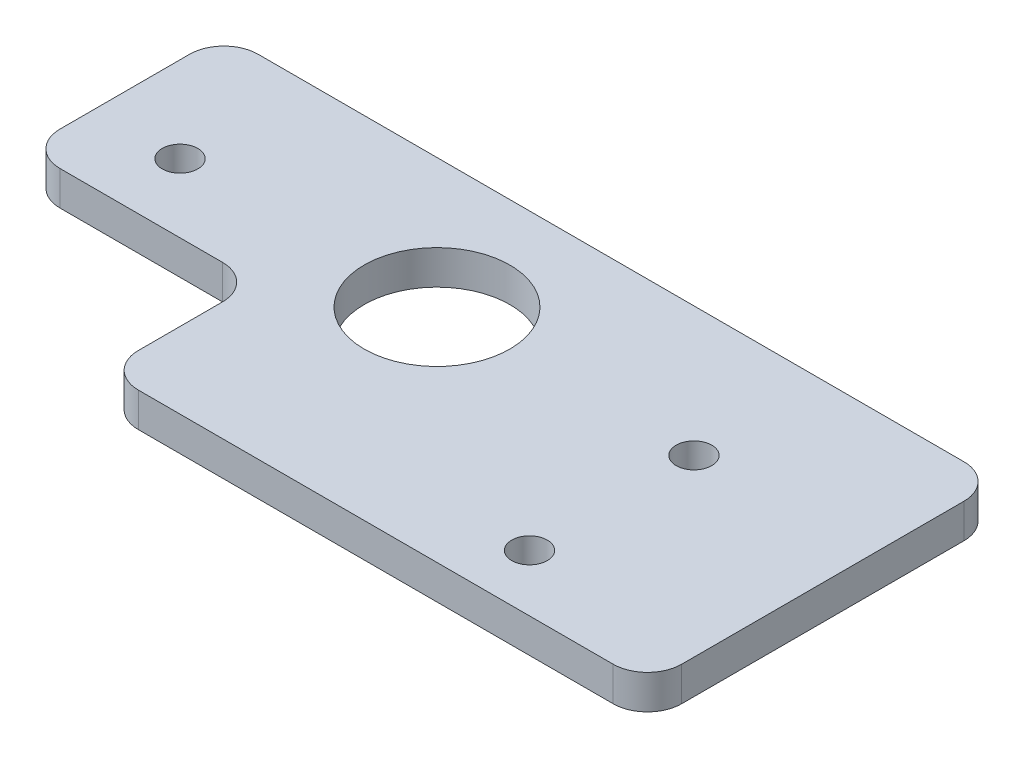
ISO-10303-21;
HEADER;
FILE_DESCRIPTION(('STEP AP214'),'2;1');
FILE_NAME('part.step','',(''),(''),'','','');
FILE_SCHEMA(('AUTOMOTIVE_DESIGN { 1 0 10303 214 1 1 1 1 }'));
ENDSEC;
DATA;
#1=APPLICATION_CONTEXT('core data for automotive mechanical design processes');
#2=APPLICATION_PROTOCOL_DEFINITION('international standard','automotive_design',2000,#1);
#3=PRODUCT_CONTEXT('',#1,'mechanical');
#4=PRODUCT('Part','Part','',(#3));
#5=PRODUCT_RELATED_PRODUCT_CATEGORY('part','',(#4));
#6=PRODUCT_DEFINITION_FORMATION('','',#4);
#7=PRODUCT_DEFINITION_CONTEXT('part definition',#1,'design');
#8=PRODUCT_DEFINITION('design','',#6,#7);
#9=PRODUCT_DEFINITION_SHAPE('','',#8);
#10=(LENGTH_UNIT() NAMED_UNIT(*) SI_UNIT(.MILLI.,.METRE.));
#11=(NAMED_UNIT(*) PLANE_ANGLE_UNIT() SI_UNIT($,.RADIAN.));
#12=(NAMED_UNIT(*) SI_UNIT($,.STERADIAN.) SOLID_ANGLE_UNIT());
#13=UNCERTAINTY_MEASURE_WITH_UNIT(LENGTH_MEASURE(1.E-05),#10,'distance_accuracy_value','');
#14=(GEOMETRIC_REPRESENTATION_CONTEXT(3) GLOBAL_UNCERTAINTY_ASSIGNED_CONTEXT((#13)) GLOBAL_UNIT_ASSIGNED_CONTEXT((#10,
#11,#12)) REPRESENTATION_CONTEXT('',''));
#15=CARTESIAN_POINT('',(0.,0.,0.));
#16=DIRECTION('',(0.,0.,1.));
#17=DIRECTION('',(1.,0.,0.));
#18=AXIS2_PLACEMENT_3D('',#15,#16,#17);
#19=CARTESIAN_POINT('',(0.,3.175,0.));
#20=DIRECTION('',(1.,0.,0.));
#21=DIRECTION('',(0.,0.,-1.));
#22=AXIS2_PLACEMENT_3D('',#19,#20,#21);
#23=PLANE('',#22);
#24=DIRECTION('',(0.,0.,1.));
#25=VECTOR('',#24,1.);
#26=CARTESIAN_POINT('',(0.,0.,0.));
#27=LINE('',#26,#25);
#28=CARTESIAN_POINT('',(0.,0.,-29.325));
#29=VERTEX_POINT('',#28);
#30=CARTESIAN_POINT('',(0.,0.,-17.325));
#31=VERTEX_POINT('',#30);
#32=EDGE_CURVE('E147',#29,#31,#27,.T.);
#33=ORIENTED_EDGE('',*,*,#32,.T.);
#34=DIRECTION('',(0.,1.,0.));
#35=VECTOR('',#34,1.);
#36=CARTESIAN_POINT('',(0.,3.175,-17.325));
#37=LINE('',#36,#35);
#38=CARTESIAN_POINT('',(0.,3.175,-17.325));
#39=VERTEX_POINT('',#38);
#40=EDGE_CURVE('E151',#31,#39,#37,.T.);
#41=ORIENTED_EDGE('',*,*,#40,.T.);
#42=DIRECTION('',(0.,0.,1.));
#43=VECTOR('',#42,1.);
#44=CARTESIAN_POINT('',(0.,3.175,0.));
#45=LINE('',#44,#43);
#46=CARTESIAN_POINT('',(0.,3.175,-29.325));
#47=VERTEX_POINT('',#46);
#48=EDGE_CURVE('E150',#47,#39,#45,.T.);
#49=ORIENTED_EDGE('',*,*,#48,.F.);
#50=DIRECTION('',(0.,-1.,0.));
#51=VECTOR('',#50,1.);
#52=CARTESIAN_POINT('',(0.,3.175,-29.325));
#53=LINE('',#52,#51);
#54=EDGE_CURVE('E135',#47,#29,#53,.T.);
#55=ORIENTED_EDGE('',*,*,#54,.T.);
#56=EDGE_LOOP('',(#33,#41,#49,#55));
#57=FACE_BOUND('',#56,.T.);
#58=ADVANCED_FACE('F41',(#57),#23,.F.);
#59=CARTESIAN_POINT('',(0.,3.175,0.));
#60=DIRECTION('',(0.,0.,-1.));
#61=DIRECTION('',(-1.,0.,0.));
#62=AXIS2_PLACEMENT_3D('',#59,#60,#61);
#63=PLANE('',#62);
#64=DIRECTION('',(1.,0.,0.));
#65=VECTOR('',#64,1.);
#66=CARTESIAN_POINT('',(0.,0.,0.));
#67=LINE('',#66,#65);
#68=CARTESIAN_POINT('',(24.575,0.,0.));
#69=VERTEX_POINT('',#68);
#70=CARTESIAN_POINT('',(68.575,0.,0.));
#71=VERTEX_POINT('',#70);
#72=EDGE_CURVE('E158',#69,#71,#67,.T.);
#73=ORIENTED_EDGE('',*,*,#72,.T.);
#74=DIRECTION('',(0.,-1.,0.));
#75=VECTOR('',#74,1.);
#76=CARTESIAN_POINT('',(68.575,3.175,0.));
#77=LINE('',#76,#75);
#78=CARTESIAN_POINT('',(68.575,3.175,0.));
#79=VERTEX_POINT('',#78);
#80=EDGE_CURVE('E210',#71,#79,#77,.F.);
#81=ORIENTED_EDGE('',*,*,#80,.T.);
#82=DIRECTION('',(1.,0.,0.));
#83=VECTOR('',#82,1.);
#84=CARTESIAN_POINT('',(0.,3.175,0.));
#85=LINE('',#84,#83);
#86=CARTESIAN_POINT('',(24.575,3.175,0.));
#87=VERTEX_POINT('',#86);
#88=EDGE_CURVE('E256',#87,#79,#85,.T.);
#89=ORIENTED_EDGE('',*,*,#88,.F.);
#90=DIRECTION('',(0.,1.,0.));
#91=VECTOR('',#90,1.);
#92=CARTESIAN_POINT('',(24.575,3.175,0.));
#93=LINE('',#92,#91);
#94=EDGE_CURVE('E208',#87,#69,#93,.F.);
#95=ORIENTED_EDGE('',*,*,#94,.T.);
#96=EDGE_LOOP('',(#73,#81,#89,#95));
#97=FACE_BOUND('',#96,.T.);
#98=ADVANCED_FACE('F279',(#97),#63,.F.);
#99=CARTESIAN_POINT('',(71.75,3.175,0.));
#100=DIRECTION('',(-1.,0.,0.));
#101=DIRECTION('',(0.,0.,1.));
#102=AXIS2_PLACEMENT_3D('',#99,#100,#101);
#103=PLANE('',#102);
#104=DIRECTION('',(0.,0.,-1.));
#105=VECTOR('',#104,1.);
#106=CARTESIAN_POINT('',(71.75,0.,0.));
#107=LINE('',#106,#105);
#108=CARTESIAN_POINT('',(71.75,0.,-3.175));
#109=VERTEX_POINT('',#108);
#110=CARTESIAN_POINT('',(71.75,0.,-29.325));
#111=VERTEX_POINT('',#110);
#112=EDGE_CURVE('E162',#109,#111,#107,.T.);
#113=ORIENTED_EDGE('',*,*,#112,.T.);
#114=DIRECTION('',(0.,-1.,0.));
#115=VECTOR('',#114,1.);
#116=CARTESIAN_POINT('',(71.75,3.175,-29.325));
#117=LINE('',#116,#115);
#118=CARTESIAN_POINT('',(71.75,3.175,-29.325));
#119=VERTEX_POINT('',#118);
#120=EDGE_CURVE('E206',#111,#119,#117,.F.);
#121=ORIENTED_EDGE('',*,*,#120,.T.);
#122=DIRECTION('',(0.,0.,-1.));
#123=VECTOR('',#122,1.);
#124=CARTESIAN_POINT('',(71.75,3.175,0.));
#125=LINE('',#124,#123);
#126=CARTESIAN_POINT('',(71.75,3.175,-3.175));
#127=VERTEX_POINT('',#126);
#128=EDGE_CURVE('E258',#127,#119,#125,.T.);
#129=ORIENTED_EDGE('',*,*,#128,.F.);
#130=DIRECTION('',(0.,-1.,0.));
#131=VECTOR('',#130,1.);
#132=CARTESIAN_POINT('',(71.75,3.175,-3.175));
#133=LINE('',#132,#131);
#134=EDGE_CURVE('E203',#127,#109,#133,.T.);
#135=ORIENTED_EDGE('',*,*,#134,.T.);
#136=EDGE_LOOP('',(#113,#121,#129,#135));
#137=FACE_BOUND('',#136,.T.);
#138=ADVANCED_FACE('F272',(#137),#103,.F.);
#139=CARTESIAN_POINT('',(0.,3.175,-32.5));
#140=DIRECTION('',(0.,0.,1.));
#141=DIRECTION('',(1.,0.,0.));
#142=AXIS2_PLACEMENT_3D('',#139,#140,#141);
#143=PLANE('',#142);
#144=DIRECTION('',(-1.,0.,0.));
#145=VECTOR('',#144,1.);
#146=CARTESIAN_POINT('',(0.,0.,-32.5));
#147=LINE('',#146,#145);
#148=CARTESIAN_POINT('',(68.575,0.,-32.5));
#149=VERTEX_POINT('',#148);
#150=CARTESIAN_POINT('',(3.175,0.,-32.5));
#151=VERTEX_POINT('',#150);
#152=EDGE_CURVE('E172',#149,#151,#147,.T.);
#153=ORIENTED_EDGE('',*,*,#152,.T.);
#154=DIRECTION('',(0.,-1.,0.));
#155=VECTOR('',#154,1.);
#156=CARTESIAN_POINT('',(3.175,3.175,-32.5));
#157=LINE('',#156,#155);
#158=CARTESIAN_POINT('',(3.175,3.175,-32.5));
#159=VERTEX_POINT('',#158);
#160=EDGE_CURVE('E136',#151,#159,#157,.F.);
#161=ORIENTED_EDGE('',*,*,#160,.T.);
#162=DIRECTION('',(-1.,0.,0.));
#163=VECTOR('',#162,1.);
#164=CARTESIAN_POINT('',(0.,3.175,-32.5));
#165=LINE('',#164,#163);
#166=CARTESIAN_POINT('',(68.575,3.175,-32.5));
#167=VERTEX_POINT('',#166);
#168=EDGE_CURVE('E152',#167,#159,#165,.T.);
#169=ORIENTED_EDGE('',*,*,#168,.F.);
#170=DIRECTION('',(0.,-1.,0.));
#171=VECTOR('',#170,1.);
#172=CARTESIAN_POINT('',(68.575,3.175,-32.5));
#173=LINE('',#172,#171);
#174=EDGE_CURVE('E199',#167,#149,#173,.T.);
#175=ORIENTED_EDGE('',*,*,#174,.T.);
#176=EDGE_LOOP('',(#153,#161,#169,#175));
#177=FACE_BOUND('',#176,.T.);
#178=ADVANCED_FACE('F266',(#177),#143,.F.);
#179=CARTESIAN_POINT('',(0.,3.175,0.));
#180=DIRECTION('',(0.,-1.,0.));
#181=DIRECTION('',(0.,0.,-1.));
#182=AXIS2_PLACEMENT_3D('',#179,#180,#181);
#183=PLANE('',#182);
#184=CARTESIAN_POINT('',(31.75,3.175,-20.5));
#185=DIRECTION('',(0.,1.,0.));
#186=DIRECTION('',(0.,0.,1.));
#187=AXIS2_PLACEMENT_3D('',#184,#185,#186);
#188=CIRCLE('',#187,6.75);
#189=CARTESIAN_POINT('',(31.75,3.175,-13.75));
#190=VERTEX_POINT('',#189);
#191=EDGE_CURVE('E231',#190,#190,#188,.T.);
#192=ORIENTED_EDGE('',*,*,#191,.F.);
#193=EDGE_LOOP('',(#192));
#194=FACE_BOUND('',#193,.T.);
#195=CARTESIAN_POINT('',(7.9375,3.175,-20.5));
#196=DIRECTION('',(0.,1.,0.));
#197=DIRECTION('',(0.,0.,1.));
#198=AXIS2_PLACEMENT_3D('',#195,#196,#197);
#199=CIRCLE('',#198,1.64999999999999);
#200=CARTESIAN_POINT('',(7.9375,3.175,-18.85));
#201=VERTEX_POINT('',#200);
#202=EDGE_CURVE('E240',#201,#201,#199,.T.);
#203=ORIENTED_EDGE('',*,*,#202,.F.);
#204=EDGE_LOOP('',(#203));
#205=FACE_BOUND('',#204,.T.);
#206=CARTESIAN_POINT('',(55.5625,3.175,-20.5));
#207=DIRECTION('',(0.,1.,0.));
#208=DIRECTION('',(0.,0.,1.));
#209=AXIS2_PLACEMENT_3D('',#206,#207,#208);
#210=CIRCLE('',#209,1.64999999999998);
#211=CARTESIAN_POINT('',(55.5625,3.175,-18.85));
#212=VERTEX_POINT('',#211);
#213=EDGE_CURVE('E247',#212,#212,#210,.T.);
#214=ORIENTED_EDGE('',*,*,#213,.F.);
#215=EDGE_LOOP('',(#214));
#216=FACE_BOUND('',#215,.T.);
#217=CARTESIAN_POINT('',(55.5625,3.175,-5.26));
#218=DIRECTION('',(0.,1.,0.));
#219=DIRECTION('',(0.,0.,1.));
#220=AXIS2_PLACEMENT_3D('',#217,#218,#219);
#221=CIRCLE('',#220,1.64999999999998);
#222=CARTESIAN_POINT('',(55.5625,3.175,-3.61000000000002));
#223=VERTEX_POINT('',#222);
#224=EDGE_CURVE('E165',#223,#223,#221,.T.);
#225=ORIENTED_EDGE('',*,*,#224,.F.);
#226=EDGE_LOOP('',(#225));
#227=FACE_BOUND('',#226,.T.);
#228=ORIENTED_EDGE('',*,*,#48,.T.);
#229=CARTESIAN_POINT('',(3.175,3.175,-17.325));
#230=DIRECTION('',(0.,-1.,0.));
#231=DIRECTION('',(0.,0.,-1.));
#232=AXIS2_PLACEMENT_3D('',#229,#230,#231);
#233=CIRCLE('',#232,3.175);
#234=CARTESIAN_POINT('',(3.175,3.175,-14.15));
#235=VERTEX_POINT('',#234);
#236=EDGE_CURVE('E183',#39,#235,#233,.F.);
#237=ORIENTED_EDGE('',*,*,#236,.T.);
#238=DIRECTION('',(-1.,0.,0.));
#239=VECTOR('',#238,1.);
#240=CARTESIAN_POINT('',(0.,3.175,-14.15));
#241=LINE('',#240,#239);
#242=CARTESIAN_POINT('',(18.225,3.175,-14.15));
#243=VERTEX_POINT('',#242);
#244=EDGE_CURVE('E217',#243,#235,#241,.T.);
#245=ORIENTED_EDGE('',*,*,#244,.F.);
#246=CARTESIAN_POINT('',(18.225,3.175,-10.975));
#247=DIRECTION('',(0.,-1.,0.));
#248=DIRECTION('',(0.,0.,-1.));
#249=AXIS2_PLACEMENT_3D('',#246,#247,#248);
#250=CIRCLE('',#249,3.175);
#251=CARTESIAN_POINT('',(21.4,3.175,-10.975));
#252=VERTEX_POINT('',#251);
#253=EDGE_CURVE('E49',#243,#252,#250,.T.);
#254=ORIENTED_EDGE('',*,*,#253,.T.);
#255=DIRECTION('',(0.,0.,-1.));
#256=VECTOR('',#255,1.);
#257=CARTESIAN_POINT('',(21.4,3.175,0.));
#258=LINE('',#257,#256);
#259=CARTESIAN_POINT('',(21.4,3.175,-3.175));
#260=VERTEX_POINT('',#259);
#261=EDGE_CURVE('E215',#260,#252,#258,.T.);
#262=ORIENTED_EDGE('',*,*,#261,.F.);
#263=CARTESIAN_POINT('',(24.575,3.175,-3.175));
#264=DIRECTION('',(0.,-1.,0.));
#265=DIRECTION('',(0.,0.,-1.));
#266=AXIS2_PLACEMENT_3D('',#263,#264,#265);
#267=CIRCLE('',#266,3.175);
#268=EDGE_CURVE('E175',#260,#87,#267,.F.);
#269=ORIENTED_EDGE('',*,*,#268,.T.);
#270=ORIENTED_EDGE('',*,*,#88,.T.);
#271=CARTESIAN_POINT('',(68.575,3.175,-3.175));
#272=DIRECTION('',(0.,-1.,0.));
#273=DIRECTION('',(0.,0.,-1.));
#274=AXIS2_PLACEMENT_3D('',#271,#272,#273);
#275=CIRCLE('',#274,3.175);
#276=EDGE_CURVE('E177',#79,#127,#275,.F.);
#277=ORIENTED_EDGE('',*,*,#276,.T.);
#278=ORIENTED_EDGE('',*,*,#128,.T.);
#279=CARTESIAN_POINT('',(68.575,3.175,-29.325));
#280=DIRECTION('',(0.,-1.,0.));
#281=DIRECTION('',(0.,0.,-1.));
#282=AXIS2_PLACEMENT_3D('',#279,#280,#281);
#283=CIRCLE('',#282,3.175);
#284=EDGE_CURVE('E179',#119,#167,#283,.F.);
#285=ORIENTED_EDGE('',*,*,#284,.T.);
#286=ORIENTED_EDGE('',*,*,#168,.T.);
#287=CARTESIAN_POINT('',(3.175,3.175,-29.325));
#288=DIRECTION('',(0.,-1.,0.));
#289=DIRECTION('',(0.,0.,-1.));
#290=AXIS2_PLACEMENT_3D('',#287,#288,#289);
#291=CIRCLE('',#290,3.175);
#292=EDGE_CURVE('E181',#159,#47,#291,.F.);
#293=ORIENTED_EDGE('',*,*,#292,.T.);
#294=EDGE_LOOP('',(#228,#237,#245,#254,#262,#269,#270,#277,#278,#285,#286,#293));
#295=FACE_BOUND('',#294,.T.);
#296=ADVANCED_FACE('F214',(#194,#205,#216,#227,#295),#183,.F.);
#297=CARTESIAN_POINT('',(0.,0.,0.));
#298=DIRECTION('',(0.,-1.,0.));
#299=DIRECTION('',(0.,0.,-1.));
#300=AXIS2_PLACEMENT_3D('',#297,#298,#299);
#301=PLANE('',#300);
#302=DIRECTION('',(-1.,0.,0.));
#303=VECTOR('',#302,1.);
#304=CARTESIAN_POINT('',(0.,0.,-14.15));
#305=LINE('',#304,#303);
#306=CARTESIAN_POINT('',(18.225,0.,-14.15));
#307=VERTEX_POINT('',#306);
#308=CARTESIAN_POINT('',(3.175,0.,-14.15));
#309=VERTEX_POINT('',#308);
#310=EDGE_CURVE('E226',#307,#309,#305,.T.);
#311=ORIENTED_EDGE('',*,*,#310,.T.);
#312=CARTESIAN_POINT('',(3.175,0.,-17.325));
#313=DIRECTION('',(0.,-1.,0.));
#314=DIRECTION('',(0.,0.,-1.));
#315=AXIS2_PLACEMENT_3D('',#312,#313,#314);
#316=CIRCLE('',#315,3.175);
#317=EDGE_CURVE('E140',#309,#31,#316,.T.);
#318=ORIENTED_EDGE('',*,*,#317,.T.);
#319=ORIENTED_EDGE('',*,*,#32,.F.);
#320=CARTESIAN_POINT('',(3.175,0.,-29.325));
#321=DIRECTION('',(0.,-1.,0.));
#322=DIRECTION('',(0.,0.,-1.));
#323=AXIS2_PLACEMENT_3D('',#320,#321,#322);
#324=CIRCLE('',#323,3.175);
#325=EDGE_CURVE('E131',#29,#151,#324,.T.);
#326=ORIENTED_EDGE('',*,*,#325,.T.);
#327=ORIENTED_EDGE('',*,*,#152,.F.);
#328=CARTESIAN_POINT('',(68.575,0.,-29.325));
#329=DIRECTION('',(0.,-1.,0.));
#330=DIRECTION('',(0.,0.,-1.));
#331=AXIS2_PLACEMENT_3D('',#328,#329,#330);
#332=CIRCLE('',#331,3.175);
#333=EDGE_CURVE('E141',#149,#111,#332,.T.);
#334=ORIENTED_EDGE('',*,*,#333,.T.);
#335=ORIENTED_EDGE('',*,*,#112,.F.);
#336=CARTESIAN_POINT('',(68.575,0.,-3.175));
#337=DIRECTION('',(0.,-1.,0.));
#338=DIRECTION('',(0.,0.,-1.));
#339=AXIS2_PLACEMENT_3D('',#336,#337,#338);
#340=CIRCLE('',#339,3.175);
#341=EDGE_CURVE('E191',#109,#71,#340,.T.);
#342=ORIENTED_EDGE('',*,*,#341,.T.);
#343=ORIENTED_EDGE('',*,*,#72,.F.);
#344=CARTESIAN_POINT('',(24.575,0.,-3.175));
#345=DIRECTION('',(0.,-1.,0.));
#346=DIRECTION('',(0.,0.,-1.));
#347=AXIS2_PLACEMENT_3D('',#344,#345,#346);
#348=CIRCLE('',#347,3.175);
#349=CARTESIAN_POINT('',(21.4,0.,-3.175));
#350=VERTEX_POINT('',#349);
#351=EDGE_CURVE('E63',#69,#350,#348,.T.);
#352=ORIENTED_EDGE('',*,*,#351,.T.);
#353=DIRECTION('',(0.,0.,-1.));
#354=VECTOR('',#353,1.);
#355=CARTESIAN_POINT('',(21.4,0.,0.));
#356=LINE('',#355,#354);
#357=CARTESIAN_POINT('',(21.4,0.,-10.975));
#358=VERTEX_POINT('',#357);
#359=EDGE_CURVE('E227',#350,#358,#356,.T.);
#360=ORIENTED_EDGE('',*,*,#359,.T.);
#361=CARTESIAN_POINT('',(18.225,0.,-10.975));
#362=DIRECTION('',(0.,-1.,0.));
#363=DIRECTION('',(0.,0.,-1.));
#364=AXIS2_PLACEMENT_3D('',#361,#362,#363);
#365=CIRCLE('',#364,3.175);
#366=EDGE_CURVE('E11',#358,#307,#365,.F.);
#367=ORIENTED_EDGE('',*,*,#366,.T.);
#368=EDGE_LOOP('',(#311,#318,#319,#326,#327,#334,#335,#342,#343,#352,#360,#367));
#369=FACE_BOUND('',#368,.T.);
#370=CARTESIAN_POINT('',(31.75,0.,-20.5));
#371=DIRECTION('',(0.,1.,0.));
#372=DIRECTION('',(0.,0.,1.));
#373=AXIS2_PLACEMENT_3D('',#370,#371,#372);
#374=CIRCLE('',#373,6.75);
#375=CARTESIAN_POINT('',(31.75,0.,-13.75));
#376=VERTEX_POINT('',#375);
#377=EDGE_CURVE('E234',#376,#376,#374,.T.);
#378=ORIENTED_EDGE('',*,*,#377,.T.);
#379=EDGE_LOOP('',(#378));
#380=FACE_BOUND('',#379,.T.);
#381=CARTESIAN_POINT('',(7.9375,0.,-20.5));
#382=DIRECTION('',(0.,1.,0.));
#383=DIRECTION('',(0.,0.,1.));
#384=AXIS2_PLACEMENT_3D('',#381,#382,#383);
#385=CIRCLE('',#384,1.65);
#386=CARTESIAN_POINT('',(7.9375,0.,-18.85));
#387=VERTEX_POINT('',#386);
#388=EDGE_CURVE('E244',#387,#387,#385,.T.);
#389=ORIENTED_EDGE('',*,*,#388,.T.);
#390=EDGE_LOOP('',(#389));
#391=FACE_BOUND('',#390,.T.);
#392=CARTESIAN_POINT('',(55.5625,0.,-20.5));
#393=DIRECTION('',(0.,1.,0.));
#394=DIRECTION('',(0.,0.,1.));
#395=AXIS2_PLACEMENT_3D('',#392,#393,#394);
#396=CIRCLE('',#395,1.65);
#397=CARTESIAN_POINT('',(55.5625,0.,-18.85));
#398=VERTEX_POINT('',#397);
#399=EDGE_CURVE('E250',#398,#398,#396,.T.);
#400=ORIENTED_EDGE('',*,*,#399,.T.);
#401=EDGE_LOOP('',(#400));
#402=FACE_BOUND('',#401,.T.);
#403=CARTESIAN_POINT('',(55.5625,0.,-5.26));
#404=DIRECTION('',(0.,1.,0.));
#405=DIRECTION('',(0.,0.,1.));
#406=AXIS2_PLACEMENT_3D('',#403,#404,#405);
#407=CIRCLE('',#406,1.65);
#408=CARTESIAN_POINT('',(55.5625,0.,-3.61));
#409=VERTEX_POINT('',#408);
#410=EDGE_CURVE('E159',#409,#409,#407,.T.);
#411=ORIENTED_EDGE('',*,*,#410,.T.);
#412=EDGE_LOOP('',(#411));
#413=FACE_BOUND('',#412,.T.);
#414=ADVANCED_FACE('F155',(#369,#380,#391,#402,#413),#301,.T.);
#415=CARTESIAN_POINT('',(55.5625,3.175,-5.26));
#416=DIRECTION('',(0.,1.,0.));
#417=DIRECTION('',(0.,0.,1.));
#418=AXIS2_PLACEMENT_3D('',#415,#416,#417);
#419=CYLINDRICAL_SURFACE('',#418,1.64999999999999);
#420=ORIENTED_EDGE('',*,*,#410,.F.);
#421=EDGE_LOOP('',(#420));
#422=FACE_BOUND('',#421,.T.);
#423=ORIENTED_EDGE('',*,*,#224,.T.);
#424=EDGE_LOOP('',(#423));
#425=FACE_BOUND('',#424,.T.);
#426=ADVANCED_FACE('F387',(#422,#425),#419,.F.);
#427=CARTESIAN_POINT('',(55.5625,3.175,-20.5));
#428=DIRECTION('',(0.,1.,0.));
#429=DIRECTION('',(0.,0.,1.));
#430=AXIS2_PLACEMENT_3D('',#427,#428,#429);
#431=CYLINDRICAL_SURFACE('',#430,1.64999999999999);
#432=ORIENTED_EDGE('',*,*,#399,.F.);
#433=EDGE_LOOP('',(#432));
#434=FACE_BOUND('',#433,.T.);
#435=ORIENTED_EDGE('',*,*,#213,.T.);
#436=EDGE_LOOP('',(#435));
#437=FACE_BOUND('',#436,.T.);
#438=ADVANCED_FACE('F377',(#434,#437),#431,.F.);
#439=CARTESIAN_POINT('',(7.9375,3.175,-20.5));
#440=DIRECTION('',(0.,1.,0.));
#441=DIRECTION('',(0.,0.,1.));
#442=AXIS2_PLACEMENT_3D('',#439,#440,#441);
#443=CYLINDRICAL_SURFACE('',#442,1.64999999999999);
#444=ORIENTED_EDGE('',*,*,#388,.F.);
#445=EDGE_LOOP('',(#444));
#446=FACE_BOUND('',#445,.T.);
#447=ORIENTED_EDGE('',*,*,#202,.T.);
#448=EDGE_LOOP('',(#447));
#449=FACE_BOUND('',#448,.T.);
#450=ADVANCED_FACE('F367',(#446,#449),#443,.F.);
#451=CARTESIAN_POINT('',(31.75,0.,-20.5));
#452=DIRECTION('',(0.,1.,0.));
#453=DIRECTION('',(0.,0.,1.));
#454=AXIS2_PLACEMENT_3D('',#451,#452,#453);
#455=CYLINDRICAL_SURFACE('',#454,6.75);
#456=ORIENTED_EDGE('',*,*,#377,.F.);
#457=EDGE_LOOP('',(#456));
#458=FACE_BOUND('',#457,.T.);
#459=ORIENTED_EDGE('',*,*,#191,.T.);
#460=EDGE_LOOP('',(#459));
#461=FACE_BOUND('',#460,.T.);
#462=ADVANCED_FACE('F358',(#458,#461),#455,.F.);
#463=CARTESIAN_POINT('',(0.,0.,-14.15));
#464=DIRECTION('',(0.,0.,-1.));
#465=DIRECTION('',(-1.,0.,0.));
#466=AXIS2_PLACEMENT_3D('',#463,#464,#465);
#467=PLANE('',#466);
#468=ORIENTED_EDGE('',*,*,#244,.T.);
#469=DIRECTION('',(0.,1.,0.));
#470=VECTOR('',#469,1.);
#471=CARTESIAN_POINT('',(3.175,0.,-14.15));
#472=LINE('',#471,#470);
#473=EDGE_CURVE('E188',#235,#309,#472,.F.);
#474=ORIENTED_EDGE('',*,*,#473,.T.);
#475=ORIENTED_EDGE('',*,*,#310,.F.);
#476=DIRECTION('',(0.,1.,0.));
#477=VECTOR('',#476,1.);
#478=CARTESIAN_POINT('',(18.225,3.175,-14.15));
#479=LINE('',#478,#477);
#480=EDGE_CURVE('E185',#307,#243,#479,.T.);
#481=ORIENTED_EDGE('',*,*,#480,.T.);
#482=EDGE_LOOP('',(#468,#474,#475,#481));
#483=FACE_BOUND('',#482,.T.);
#484=ADVANCED_FACE('F229',(#483),#467,.F.);
#485=CARTESIAN_POINT('',(21.4,0.,0.));
#486=DIRECTION('',(1.,0.,0.));
#487=DIRECTION('',(0.,0.,-1.));
#488=AXIS2_PLACEMENT_3D('',#485,#486,#487);
#489=PLANE('',#488);
#490=ORIENTED_EDGE('',*,*,#261,.T.);
#491=DIRECTION('',(0.,1.,0.));
#492=VECTOR('',#491,1.);
#493=CARTESIAN_POINT('',(21.4,0.,-10.975));
#494=LINE('',#493,#492);
#495=EDGE_CURVE('E56',#252,#358,#494,.F.);
#496=ORIENTED_EDGE('',*,*,#495,.T.);
#497=ORIENTED_EDGE('',*,*,#359,.F.);
#498=DIRECTION('',(0.,1.,0.));
#499=VECTOR('',#498,1.);
#500=CARTESIAN_POINT('',(21.4,0.,-3.175));
#501=LINE('',#500,#499);
#502=EDGE_CURVE('E195',#350,#260,#501,.T.);
#503=ORIENTED_EDGE('',*,*,#502,.T.);
#504=EDGE_LOOP('',(#490,#496,#497,#503));
#505=FACE_BOUND('',#504,.T.);
#506=ADVANCED_FACE('F220',(#505),#489,.F.);
#507=CARTESIAN_POINT('',(3.175,3.175,-17.325));
#508=DIRECTION('',(0.,1.,0.));
#509=DIRECTION('',(0.,0.,1.));
#510=AXIS2_PLACEMENT_3D('',#507,#508,#509);
#511=CYLINDRICAL_SURFACE('',#510,3.175);
#512=ORIENTED_EDGE('',*,*,#317,.F.);
#513=ORIENTED_EDGE('',*,*,#473,.F.);
#514=ORIENTED_EDGE('',*,*,#236,.F.);
#515=ORIENTED_EDGE('',*,*,#40,.F.);
#516=EDGE_LOOP('',(#512,#513,#514,#515));
#517=FACE_BOUND('',#516,.T.);
#518=ADVANCED_FACE('F295',(#517),#511,.T.);
#519=CARTESIAN_POINT('',(18.225,0.,-10.975));
#520=DIRECTION('',(0.,-1.,0.));
#521=DIRECTION('',(0.,0.,-1.));
#522=AXIS2_PLACEMENT_3D('',#519,#520,#521);
#523=CYLINDRICAL_SURFACE('',#522,3.175);
#524=ORIENTED_EDGE('',*,*,#366,.F.);
#525=ORIENTED_EDGE('',*,*,#495,.F.);
#526=ORIENTED_EDGE('',*,*,#253,.F.);
#527=ORIENTED_EDGE('',*,*,#480,.F.);
#528=EDGE_LOOP('',(#524,#525,#526,#527));
#529=FACE_BOUND('',#528,.T.);
#530=ADVANCED_FACE('F224',(#529),#523,.F.);
#531=CARTESIAN_POINT('',(3.175,3.175,-29.325));
#532=DIRECTION('',(0.,-1.,0.));
#533=DIRECTION('',(0.,0.,-1.));
#534=AXIS2_PLACEMENT_3D('',#531,#532,#533);
#535=CYLINDRICAL_SURFACE('',#534,3.175);
#536=ORIENTED_EDGE('',*,*,#292,.F.);
#537=ORIENTED_EDGE('',*,*,#160,.F.);
#538=ORIENTED_EDGE('',*,*,#325,.F.);
#539=ORIENTED_EDGE('',*,*,#54,.F.);
#540=EDGE_LOOP('',(#536,#537,#538,#539));
#541=FACE_BOUND('',#540,.T.);
#542=ADVANCED_FACE('F134',(#541),#535,.T.);
#543=CARTESIAN_POINT('',(68.575,3.175,-29.325));
#544=DIRECTION('',(0.,-1.,0.));
#545=DIRECTION('',(0.,0.,-1.));
#546=AXIS2_PLACEMENT_3D('',#543,#544,#545);
#547=CYLINDRICAL_SURFACE('',#546,3.175);
#548=ORIENTED_EDGE('',*,*,#284,.F.);
#549=ORIENTED_EDGE('',*,*,#120,.F.);
#550=ORIENTED_EDGE('',*,*,#333,.F.);
#551=ORIENTED_EDGE('',*,*,#174,.F.);
#552=EDGE_LOOP('',(#548,#549,#550,#551));
#553=FACE_BOUND('',#552,.T.);
#554=ADVANCED_FACE('F268',(#553),#547,.T.);
#555=CARTESIAN_POINT('',(68.575,3.175,-3.175));
#556=DIRECTION('',(0.,-1.,0.));
#557=DIRECTION('',(0.,0.,-1.));
#558=AXIS2_PLACEMENT_3D('',#555,#556,#557);
#559=CYLINDRICAL_SURFACE('',#558,3.175);
#560=ORIENTED_EDGE('',*,*,#276,.F.);
#561=ORIENTED_EDGE('',*,*,#80,.F.);
#562=ORIENTED_EDGE('',*,*,#341,.F.);
#563=ORIENTED_EDGE('',*,*,#134,.F.);
#564=EDGE_LOOP('',(#560,#561,#562,#563));
#565=FACE_BOUND('',#564,.T.);
#566=ADVANCED_FACE('F276',(#565),#559,.T.);
#567=CARTESIAN_POINT('',(24.575,0.,-3.175));
#568=DIRECTION('',(0.,1.,0.));
#569=DIRECTION('',(0.,0.,1.));
#570=AXIS2_PLACEMENT_3D('',#567,#568,#569);
#571=CYLINDRICAL_SURFACE('',#570,3.175);
#572=ORIENTED_EDGE('',*,*,#351,.F.);
#573=ORIENTED_EDGE('',*,*,#94,.F.);
#574=ORIENTED_EDGE('',*,*,#268,.F.);
#575=ORIENTED_EDGE('',*,*,#502,.F.);
#576=EDGE_LOOP('',(#572,#573,#574,#575));
#577=FACE_BOUND('',#576,.T.);
#578=ADVANCED_FACE('F43',(#577),#571,.T.);
#579=CLOSED_SHELL('',(#58,#98,#138,#178,#296,#414,#426,#438,#450,#462,#484,#506,#518,#530,#542,
#554,#566,#578));
#580=MANIFOLD_SOLID_BREP('B2',#579);
#581=ADVANCED_BREP_SHAPE_REPRESENTATION('',(#18,#580),#14);
#582=SHAPE_DEFINITION_REPRESENTATION(#9,#581);
ENDSEC;
END-ISO-10303-21;
